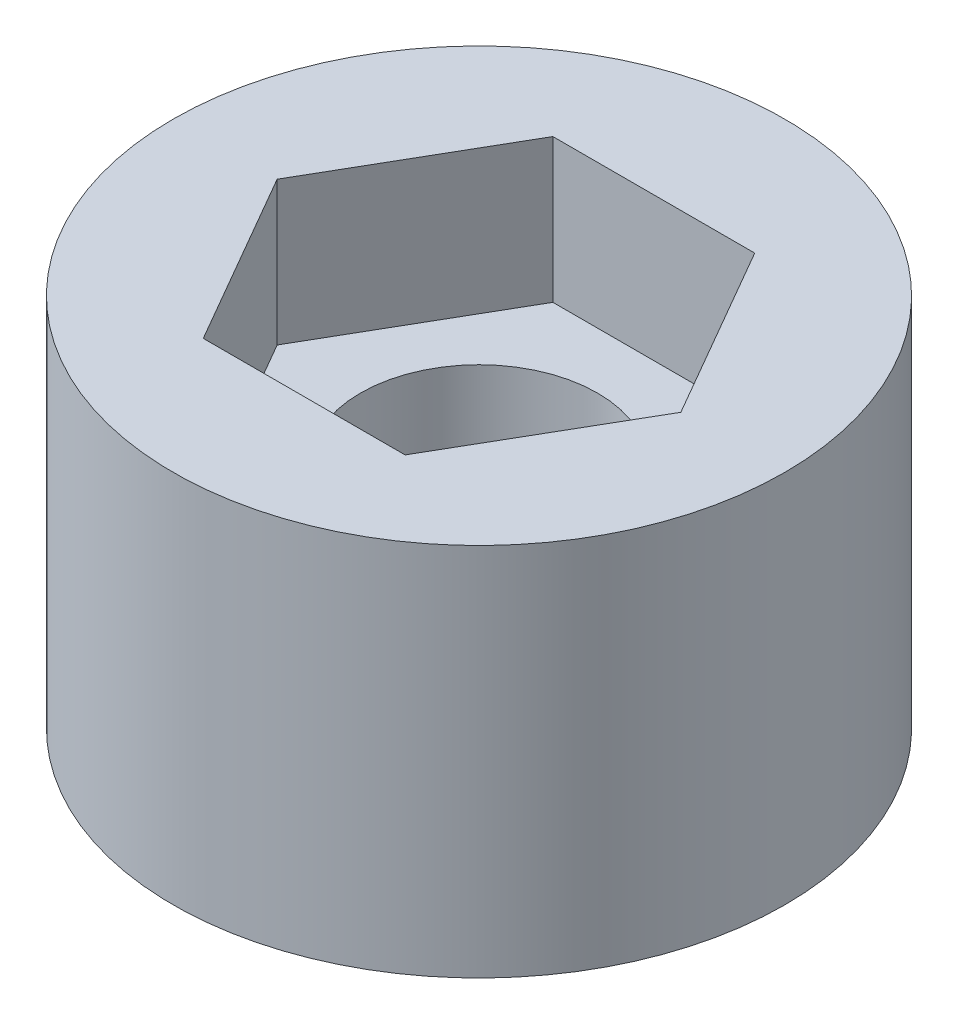
ISO-10303-21;
HEADER;
FILE_DESCRIPTION(('STEP AP214'),'2;1');
FILE_NAME('part.step','',(''),(''),'','','');
FILE_SCHEMA(('AUTOMOTIVE_DESIGN { 1 0 10303 214 1 1 1 1 }'));
ENDSEC;
DATA;
#1=APPLICATION_CONTEXT('core data for automotive mechanical design processes');
#2=APPLICATION_PROTOCOL_DEFINITION('international standard','automotive_design',2000,#1);
#3=PRODUCT_CONTEXT('',#1,'mechanical');
#4=PRODUCT('Part','Part','',(#3));
#5=PRODUCT_RELATED_PRODUCT_CATEGORY('part','',(#4));
#6=PRODUCT_DEFINITION_FORMATION('','',#4);
#7=PRODUCT_DEFINITION_CONTEXT('part definition',#1,'design');
#8=PRODUCT_DEFINITION('design','',#6,#7);
#9=PRODUCT_DEFINITION_SHAPE('','',#8);
#10=(LENGTH_UNIT() NAMED_UNIT(*) SI_UNIT(.MILLI.,.METRE.));
#11=(NAMED_UNIT(*) PLANE_ANGLE_UNIT() SI_UNIT($,.RADIAN.));
#12=(NAMED_UNIT(*) SI_UNIT($,.STERADIAN.) SOLID_ANGLE_UNIT());
#13=UNCERTAINTY_MEASURE_WITH_UNIT(LENGTH_MEASURE(1.E-05),#10,'distance_accuracy_value','');
#14=(GEOMETRIC_REPRESENTATION_CONTEXT(3) GLOBAL_UNCERTAINTY_ASSIGNED_CONTEXT((#13)) GLOBAL_UNIT_ASSIGNED_CONTEXT((#10,
#11,#12)) REPRESENTATION_CONTEXT('',''));
#15=CARTESIAN_POINT('',(0.,0.,0.));
#16=DIRECTION('',(0.,0.,1.));
#17=DIRECTION('',(1.,0.,0.));
#18=AXIS2_PLACEMENT_3D('',#15,#16,#17);
#19=CARTESIAN_POINT('',(0.,6.,0.));
#20=DIRECTION('',(0.,-1.,0.));
#21=DIRECTION('',(0.,0.,-1.));
#22=AXIS2_PLACEMENT_3D('',#19,#20,#21);
#23=CYLINDRICAL_SURFACE('',#22,1.9);
#24=CARTESIAN_POINT('',(0.,0.,0.));
#25=DIRECTION('',(0.,1.,0.));
#26=DIRECTION('',(0.,0.,1.));
#27=AXIS2_PLACEMENT_3D('',#24,#25,#26);
#28=CIRCLE('',#27,1.9);
#29=CARTESIAN_POINT('',(0.,0.,1.9));
#30=VERTEX_POINT('',#29);
#31=EDGE_CURVE('E149',#30,#30,#28,.T.);
#32=ORIENTED_EDGE('',*,*,#31,.F.);
#33=EDGE_LOOP('',(#32));
#34=FACE_BOUND('',#33,.T.);
#35=CARTESIAN_POINT('',(0.,3.7,0.));
#36=DIRECTION('',(0.,1.,0.));
#37=DIRECTION('',(0.,0.,1.));
#38=AXIS2_PLACEMENT_3D('',#35,#36,#37);
#39=CIRCLE('',#38,1.9);
#40=CARTESIAN_POINT('',(0.,3.7,1.9));
#41=VERTEX_POINT('',#40);
#42=EDGE_CURVE('E44',#41,#41,#39,.T.);
#43=ORIENTED_EDGE('',*,*,#42,.T.);
#44=EDGE_LOOP('',(#43));
#45=FACE_BOUND('',#44,.T.);
#46=ADVANCED_FACE('F40',(#34,#45),#23,.F.);
#47=CARTESIAN_POINT('',(0.,6.,0.));
#48=DIRECTION('',(0.,1.,0.));
#49=DIRECTION('',(0.,0.,1.));
#50=AXIS2_PLACEMENT_3D('',#47,#48,#49);
#51=PLANE('',#50);
#52=DIRECTION('',(0.499999999999999,0.,-0.866025403784439));
#53=VECTOR('',#52,1.);
#54=CARTESIAN_POINT('',(1.61658075373095,6.,2.8));
#55=LINE('',#54,#53);
#56=CARTESIAN_POINT('',(1.61658075373095,6.,2.8));
#57=VERTEX_POINT('',#56);
#58=CARTESIAN_POINT('',(3.2331615074619,6.,0.));
#59=VERTEX_POINT('',#58);
#60=EDGE_CURVE('E57',#57,#59,#55,.T.);
#61=ORIENTED_EDGE('',*,*,#60,.F.);
#62=DIRECTION('',(1.,0.,0.));
#63=VECTOR('',#62,1.);
#64=CARTESIAN_POINT('',(-1.61658075373095,6.,2.8));
#65=LINE('',#64,#63);
#66=CARTESIAN_POINT('',(-1.61658075373095,6.,2.8));
#67=VERTEX_POINT('',#66);
#68=EDGE_CURVE('E140',#67,#57,#65,.T.);
#69=ORIENTED_EDGE('',*,*,#68,.F.);
#70=DIRECTION('',(0.5,0.,0.866025403784439));
#71=VECTOR('',#70,1.);
#72=CARTESIAN_POINT('',(-3.2331615074619,6.,0.));
#73=LINE('',#72,#71);
#74=CARTESIAN_POINT('',(-3.2331615074619,6.,0.));
#75=VERTEX_POINT('',#74);
#76=EDGE_CURVE('E138',#75,#67,#73,.T.);
#77=ORIENTED_EDGE('',*,*,#76,.F.);
#78=DIRECTION('',(-0.5,0.,0.866025403784439));
#79=VECTOR('',#78,1.);
#80=CARTESIAN_POINT('',(-1.61658075373095,6.,-2.8));
#81=LINE('',#80,#79);
#82=CARTESIAN_POINT('',(-1.61658075373095,6.,-2.8));
#83=VERTEX_POINT('',#82);
#84=EDGE_CURVE('E105',#83,#75,#81,.T.);
#85=ORIENTED_EDGE('',*,*,#84,.F.);
#86=DIRECTION('',(-1.,0.,0.));
#87=VECTOR('',#86,1.);
#88=CARTESIAN_POINT('',(1.61658075373095,6.,-2.8));
#89=LINE('',#88,#87);
#90=CARTESIAN_POINT('',(1.61658075373095,6.,-2.8));
#91=VERTEX_POINT('',#90);
#92=EDGE_CURVE('E134',#91,#83,#89,.T.);
#93=ORIENTED_EDGE('',*,*,#92,.F.);
#94=DIRECTION('',(-0.5,0.,-0.866025403784439));
#95=VECTOR('',#94,1.);
#96=CARTESIAN_POINT('',(3.2331615074619,6.,0.));
#97=LINE('',#96,#95);
#98=EDGE_CURVE('E131',#59,#91,#97,.T.);
#99=ORIENTED_EDGE('',*,*,#98,.F.);
#100=EDGE_LOOP('',(#61,#69,#77,#85,#93,#99));
#101=FACE_BOUND('',#100,.T.);
#102=CARTESIAN_POINT('',(0.,6.,0.));
#103=DIRECTION('',(0.,1.,0.));
#104=DIRECTION('',(1.,0.,0.));
#105=AXIS2_PLACEMENT_3D('',#102,#103,#104);
#106=CIRCLE('',#105,4.9);
#107=CARTESIAN_POINT('',(4.9,6.,0.));
#108=VERTEX_POINT('',#107);
#109=EDGE_CURVE('E12',#108,#108,#106,.T.);
#110=ORIENTED_EDGE('',*,*,#109,.T.);
#111=EDGE_LOOP('',(#110));
#112=FACE_BOUND('',#111,.T.);
#113=ADVANCED_FACE('F158',(#101,#112),#51,.T.);
#114=CARTESIAN_POINT('',(0.,0.,0.));
#115=DIRECTION('',(0.,1.,0.));
#116=DIRECTION('',(0.,0.,1.));
#117=AXIS2_PLACEMENT_3D('',#114,#115,#116);
#118=PLANE('',#117);
#119=CARTESIAN_POINT('',(0.,0.,0.));
#120=DIRECTION('',(0.,1.,0.));
#121=DIRECTION('',(1.,0.,0.));
#122=AXIS2_PLACEMENT_3D('',#119,#120,#121);
#123=CIRCLE('',#122,4.9);
#124=CARTESIAN_POINT('',(4.9,0.,0.));
#125=VERTEX_POINT('',#124);
#126=EDGE_CURVE('E49',#125,#125,#123,.T.);
#127=ORIENTED_EDGE('',*,*,#126,.F.);
#128=EDGE_LOOP('',(#127));
#129=FACE_BOUND('',#128,.T.);
#130=ORIENTED_EDGE('',*,*,#31,.T.);
#131=EDGE_LOOP('',(#130));
#132=FACE_BOUND('',#131,.T.);
#133=ADVANCED_FACE('F155',(#129,#132),#118,.F.);
#134=CARTESIAN_POINT('',(0.,6.,0.));
#135=DIRECTION('',(0.,-1.,0.));
#136=DIRECTION('',(0.,0.,-1.));
#137=AXIS2_PLACEMENT_3D('',#134,#135,#136);
#138=CYLINDRICAL_SURFACE('',#137,4.9);
#139=ORIENTED_EDGE('',*,*,#109,.F.);
#140=EDGE_LOOP('',(#139));
#141=FACE_BOUND('',#140,.T.);
#142=ORIENTED_EDGE('',*,*,#126,.T.);
#143=EDGE_LOOP('',(#142));
#144=FACE_BOUND('',#143,.T.);
#145=ADVANCED_FACE('F42',(#141,#144),#138,.T.);
#146=CARTESIAN_POINT('',(1.61658075373095,3.7,2.8));
#147=DIRECTION('',(0.866025403784439,0.,0.5));
#148=DIRECTION('',(0.5,0.,-0.866025403784439));
#149=AXIS2_PLACEMENT_3D('',#146,#147,#148);
#150=PLANE('',#149);
#151=ORIENTED_EDGE('',*,*,#60,.T.);
#152=DIRECTION('',(0.,1.,0.));
#153=VECTOR('',#152,1.);
#154=CARTESIAN_POINT('',(3.2331615074619,3.7,0.));
#155=LINE('',#154,#153);
#156=CARTESIAN_POINT('',(3.2331615074619,3.7,0.));
#157=VERTEX_POINT('',#156);
#158=EDGE_CURVE('E87',#157,#59,#155,.T.);
#159=ORIENTED_EDGE('',*,*,#158,.F.);
#160=DIRECTION('',(0.499999999999999,0.,-0.866025403784439));
#161=VECTOR('',#160,1.);
#162=CARTESIAN_POINT('',(1.61658075373095,3.7,2.8));
#163=LINE('',#162,#161);
#164=CARTESIAN_POINT('',(1.61658075373095,3.7,2.8));
#165=VERTEX_POINT('',#164);
#166=EDGE_CURVE('E142',#165,#157,#163,.T.);
#167=ORIENTED_EDGE('',*,*,#166,.F.);
#168=DIRECTION('',(0.,1.,0.));
#169=VECTOR('',#168,1.);
#170=CARTESIAN_POINT('',(1.61658075373095,3.7,2.8));
#171=LINE('',#170,#169);
#172=EDGE_CURVE('E65',#165,#57,#171,.T.);
#173=ORIENTED_EDGE('',*,*,#172,.T.);
#174=EDGE_LOOP('',(#151,#159,#167,#173));
#175=FACE_BOUND('',#174,.T.);
#176=ADVANCED_FACE('F180',(#175),#150,.F.);
#177=CARTESIAN_POINT('',(-1.61658075373095,3.7,2.8));
#178=DIRECTION('',(0.,0.,1.));
#179=DIRECTION('',(1.,0.,0.));
#180=AXIS2_PLACEMENT_3D('',#177,#178,#179);
#181=PLANE('',#180);
#182=ORIENTED_EDGE('',*,*,#68,.T.);
#183=ORIENTED_EDGE('',*,*,#172,.F.);
#184=DIRECTION('',(1.,0.,0.));
#185=VECTOR('',#184,1.);
#186=CARTESIAN_POINT('',(-1.61658075373095,3.7,2.8));
#187=LINE('',#186,#185);
#188=CARTESIAN_POINT('',(-1.61658075373095,3.7,2.8));
#189=VERTEX_POINT('',#188);
#190=EDGE_CURVE('E117',#189,#165,#187,.T.);
#191=ORIENTED_EDGE('',*,*,#190,.F.);
#192=DIRECTION('',(0.,1.,0.));
#193=VECTOR('',#192,1.);
#194=CARTESIAN_POINT('',(-1.61658075373095,3.7,2.8));
#195=LINE('',#194,#193);
#196=EDGE_CURVE('E109',#189,#67,#195,.T.);
#197=ORIENTED_EDGE('',*,*,#196,.T.);
#198=EDGE_LOOP('',(#182,#183,#191,#197));
#199=FACE_BOUND('',#198,.T.);
#200=ADVANCED_FACE('F177',(#199),#181,.F.);
#201=CARTESIAN_POINT('',(-3.2331615074619,3.7,0.));
#202=DIRECTION('',(-0.866025403784439,0.,0.5));
#203=DIRECTION('',(0.5,0.,0.866025403784439));
#204=AXIS2_PLACEMENT_3D('',#201,#202,#203);
#205=PLANE('',#204);
#206=ORIENTED_EDGE('',*,*,#76,.T.);
#207=ORIENTED_EDGE('',*,*,#196,.F.);
#208=DIRECTION('',(0.5,0.,0.866025403784439));
#209=VECTOR('',#208,1.);
#210=CARTESIAN_POINT('',(-3.2331615074619,3.7,0.));
#211=LINE('',#210,#209);
#212=CARTESIAN_POINT('',(-3.2331615074619,3.7,0.));
#213=VERTEX_POINT('',#212);
#214=EDGE_CURVE('E113',#213,#189,#211,.T.);
#215=ORIENTED_EDGE('',*,*,#214,.F.);
#216=DIRECTION('',(0.,1.,0.));
#217=VECTOR('',#216,1.);
#218=CARTESIAN_POINT('',(-3.2331615074619,3.7,0.));
#219=LINE('',#218,#217);
#220=EDGE_CURVE('E98',#213,#75,#219,.T.);
#221=ORIENTED_EDGE('',*,*,#220,.T.);
#222=EDGE_LOOP('',(#206,#207,#215,#221));
#223=FACE_BOUND('',#222,.T.);
#224=ADVANCED_FACE('F114',(#223),#205,.F.);
#225=CARTESIAN_POINT('',(-1.61658075373095,3.7,-2.8));
#226=DIRECTION('',(-0.866025403784439,0.,-0.5));
#227=DIRECTION('',(-0.5,0.,0.866025403784439));
#228=AXIS2_PLACEMENT_3D('',#225,#226,#227);
#229=PLANE('',#228);
#230=ORIENTED_EDGE('',*,*,#84,.T.);
#231=ORIENTED_EDGE('',*,*,#220,.F.);
#232=DIRECTION('',(-0.5,0.,0.866025403784439));
#233=VECTOR('',#232,1.);
#234=CARTESIAN_POINT('',(-1.61658075373095,3.7,-2.8));
#235=LINE('',#234,#233);
#236=CARTESIAN_POINT('',(-1.61658075373095,3.7,-2.8));
#237=VERTEX_POINT('',#236);
#238=EDGE_CURVE('E102',#237,#213,#235,.T.);
#239=ORIENTED_EDGE('',*,*,#238,.F.);
#240=DIRECTION('',(0.,1.,0.));
#241=VECTOR('',#240,1.);
#242=CARTESIAN_POINT('',(-1.61658075373095,3.7,-2.8));
#243=LINE('',#242,#241);
#244=EDGE_CURVE('E110',#237,#83,#243,.T.);
#245=ORIENTED_EDGE('',*,*,#244,.T.);
#246=EDGE_LOOP('',(#230,#231,#239,#245));
#247=FACE_BOUND('',#246,.T.);
#248=ADVANCED_FACE('F100',(#247),#229,.F.);
#249=CARTESIAN_POINT('',(1.61658075373095,3.7,-2.8));
#250=DIRECTION('',(0.,0.,-1.));
#251=DIRECTION('',(-1.,0.,0.));
#252=AXIS2_PLACEMENT_3D('',#249,#250,#251);
#253=PLANE('',#252);
#254=ORIENTED_EDGE('',*,*,#92,.T.);
#255=ORIENTED_EDGE('',*,*,#244,.F.);
#256=DIRECTION('',(-1.,0.,0.));
#257=VECTOR('',#256,1.);
#258=CARTESIAN_POINT('',(1.61658075373095,3.7,-2.8));
#259=LINE('',#258,#257);
#260=CARTESIAN_POINT('',(1.61658075373095,3.7,-2.8));
#261=VERTEX_POINT('',#260);
#262=EDGE_CURVE('E123',#261,#237,#259,.T.);
#263=ORIENTED_EDGE('',*,*,#262,.F.);
#264=DIRECTION('',(0.,1.,0.));
#265=VECTOR('',#264,1.);
#266=CARTESIAN_POINT('',(1.61658075373095,3.7,-2.8));
#267=LINE('',#266,#265);
#268=EDGE_CURVE('E146',#261,#91,#267,.T.);
#269=ORIENTED_EDGE('',*,*,#268,.T.);
#270=EDGE_LOOP('',(#254,#255,#263,#269));
#271=FACE_BOUND('',#270,.T.);
#272=ADVANCED_FACE('F173',(#271),#253,.F.);
#273=CARTESIAN_POINT('',(3.2331615074619,3.7,0.));
#274=DIRECTION('',(0.866025403784439,0.,-0.5));
#275=DIRECTION('',(-0.5,0.,-0.866025403784439));
#276=AXIS2_PLACEMENT_3D('',#273,#274,#275);
#277=PLANE('',#276);
#278=ORIENTED_EDGE('',*,*,#98,.T.);
#279=ORIENTED_EDGE('',*,*,#268,.F.);
#280=DIRECTION('',(-0.5,0.,-0.866025403784439));
#281=VECTOR('',#280,1.);
#282=CARTESIAN_POINT('',(3.2331615074619,3.7,0.));
#283=LINE('',#282,#281);
#284=EDGE_CURVE('E125',#157,#261,#283,.T.);
#285=ORIENTED_EDGE('',*,*,#284,.F.);
#286=ORIENTED_EDGE('',*,*,#158,.T.);
#287=EDGE_LOOP('',(#278,#279,#285,#286));
#288=FACE_BOUND('',#287,.T.);
#289=ADVANCED_FACE('F168',(#288),#277,.F.);
#290=CARTESIAN_POINT('',(0.,3.7,0.));
#291=DIRECTION('',(0.,1.,0.));
#292=DIRECTION('',(0.,0.,1.));
#293=AXIS2_PLACEMENT_3D('',#290,#291,#292);
#294=PLANE('',#293);
#295=ORIENTED_EDGE('',*,*,#42,.F.);
#296=EDGE_LOOP('',(#295));
#297=FACE_BOUND('',#296,.T.);
#298=ORIENTED_EDGE('',*,*,#166,.T.);
#299=ORIENTED_EDGE('',*,*,#284,.T.);
#300=ORIENTED_EDGE('',*,*,#262,.T.);
#301=ORIENTED_EDGE('',*,*,#238,.T.);
#302=ORIENTED_EDGE('',*,*,#214,.T.);
#303=ORIENTED_EDGE('',*,*,#190,.T.);
#304=EDGE_LOOP('',(#298,#299,#300,#301,#302,#303));
#305=FACE_BOUND('',#304,.T.);
#306=ADVANCED_FACE('F120',(#297,#305),#294,.T.);
#307=CLOSED_SHELL('',(#46,#113,#133,#145,#176,#200,#224,#248,#272,#289,#306));
#308=MANIFOLD_SOLID_BREP('B2',#307);
#309=ADVANCED_BREP_SHAPE_REPRESENTATION('',(#18,#308),#14);
#310=SHAPE_DEFINITION_REPRESENTATION(#9,#309);
ENDSEC;
END-ISO-10303-21;
